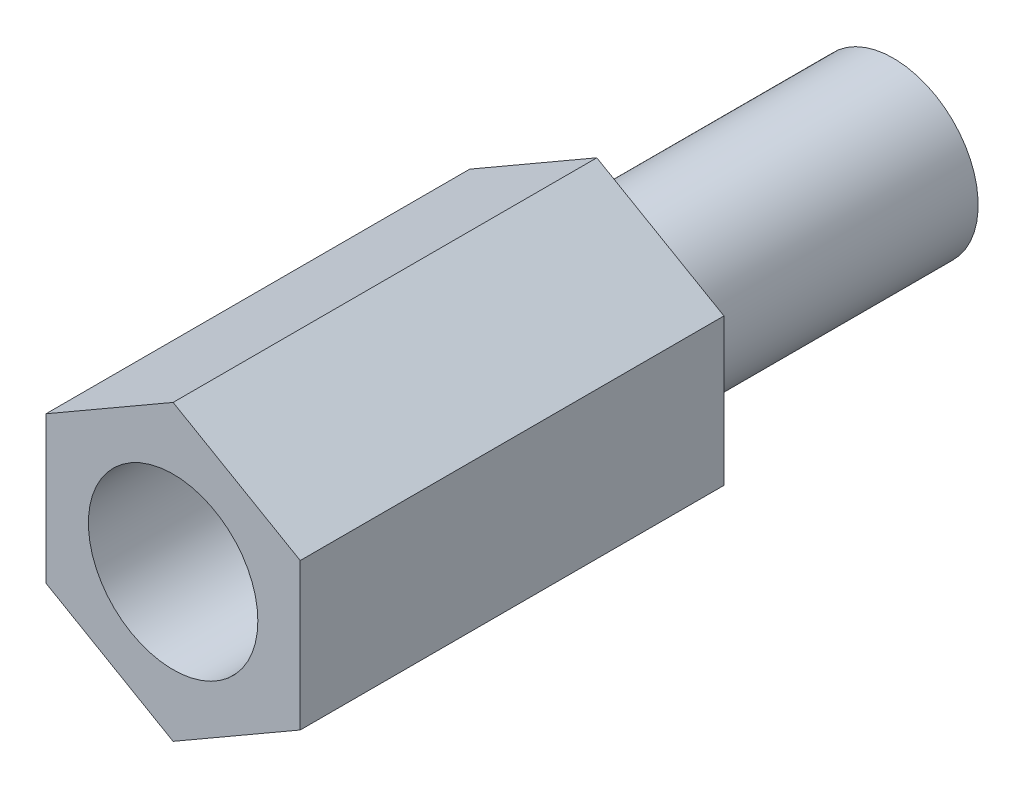
ISO-10303-21;
HEADER;
FILE_DESCRIPTION(('STEP AP214'),'2;1');
FILE_NAME('part.step','',(''),(''),'','','');
FILE_SCHEMA(('AUTOMOTIVE_DESIGN { 1 0 10303 214 1 1 1 1 }'));
ENDSEC;
DATA;
#1=APPLICATION_CONTEXT('core data for automotive mechanical design processes');
#2=APPLICATION_PROTOCOL_DEFINITION('international standard','automotive_design',2000,#1);
#3=PRODUCT_CONTEXT('',#1,'mechanical');
#4=PRODUCT('Part','Part','',(#3));
#5=PRODUCT_RELATED_PRODUCT_CATEGORY('part','',(#4));
#6=PRODUCT_DEFINITION_FORMATION('','',#4);
#7=PRODUCT_DEFINITION_CONTEXT('part definition',#1,'design');
#8=PRODUCT_DEFINITION('design','',#6,#7);
#9=PRODUCT_DEFINITION_SHAPE('','',#8);
#10=(LENGTH_UNIT() NAMED_UNIT(*) SI_UNIT(.MILLI.,.METRE.));
#11=(NAMED_UNIT(*) PLANE_ANGLE_UNIT() SI_UNIT($,.RADIAN.));
#12=(NAMED_UNIT(*) SI_UNIT($,.STERADIAN.) SOLID_ANGLE_UNIT());
#13=UNCERTAINTY_MEASURE_WITH_UNIT(LENGTH_MEASURE(1.E-05),#10,'distance_accuracy_value','');
#14=(GEOMETRIC_REPRESENTATION_CONTEXT(3) GLOBAL_UNCERTAINTY_ASSIGNED_CONTEXT((#13)) GLOBAL_UNIT_ASSIGNED_CONTEXT((#10,
#11,#12)) REPRESENTATION_CONTEXT('',''));
#15=CARTESIAN_POINT('',(0.,0.,0.));
#16=DIRECTION('',(0.,0.,1.));
#17=DIRECTION('',(1.,0.,0.));
#18=AXIS2_PLACEMENT_3D('',#15,#16,#17);
#19=CARTESIAN_POINT('',(-3.00000000000003,-1.73205080756889,10.));
#20=DIRECTION('',(0.5,0.866025403784439,0.));
#21=DIRECTION('',(-0.866025403784439,0.5,0.));
#22=AXIS2_PLACEMENT_3D('',#19,#20,#21);
#23=PLANE('',#22);
#24=DIRECTION('',(0.866025403784439,-0.5,0.));
#25=VECTOR('',#24,1.);
#26=CARTESIAN_POINT('',(-3.00000000000003,-1.73205080756889,0.));
#27=LINE('',#26,#25);
#28=CARTESIAN_POINT('',(-3.00000000000003,-1.73205080756889,0.));
#29=VERTEX_POINT('',#28);
#30=CARTESIAN_POINT('',(0.,-3.46410161513779,0.));
#31=VERTEX_POINT('',#30);
#32=EDGE_CURVE('E130',#29,#31,#27,.T.);
#33=ORIENTED_EDGE('',*,*,#32,.T.);
#34=DIRECTION('',(0.,0.,-1.));
#35=VECTOR('',#34,1.);
#36=CARTESIAN_POINT('',(0.,-3.46410161513779,10.));
#37=LINE('',#36,#35);
#38=CARTESIAN_POINT('',(0.,-3.46410161513779,10.));
#39=VERTEX_POINT('',#38);
#40=EDGE_CURVE('E42',#39,#31,#37,.T.);
#41=ORIENTED_EDGE('',*,*,#40,.F.);
#42=DIRECTION('',(0.866025403784439,-0.5,0.));
#43=VECTOR('',#42,1.);
#44=CARTESIAN_POINT('',(-3.00000000000003,-1.73205080756889,10.));
#45=LINE('',#44,#43);
#46=CARTESIAN_POINT('',(-3.00000000000003,-1.73205080756889,10.));
#47=VERTEX_POINT('',#46);
#48=EDGE_CURVE('E147',#47,#39,#45,.T.);
#49=ORIENTED_EDGE('',*,*,#48,.F.);
#50=DIRECTION('',(0.,0.,-1.));
#51=VECTOR('',#50,1.);
#52=CARTESIAN_POINT('',(-3.00000000000003,-1.73205080756889,10.));
#53=LINE('',#52,#51);
#54=EDGE_CURVE('E126',#47,#29,#53,.T.);
#55=ORIENTED_EDGE('',*,*,#54,.T.);
#56=EDGE_LOOP('',(#33,#41,#49,#55));
#57=FACE_BOUND('',#56,.T.);
#58=ADVANCED_FACE('F39',(#57),#23,.F.);
#59=CARTESIAN_POINT('',(0.,-3.46410161513779,10.));
#60=DIRECTION('',(-0.5,0.866025403784439,0.));
#61=DIRECTION('',(-0.866025403784439,-0.5,0.));
#62=AXIS2_PLACEMENT_3D('',#59,#60,#61);
#63=PLANE('',#62);
#64=DIRECTION('',(0.866025403784439,0.5,0.));
#65=VECTOR('',#64,1.);
#66=CARTESIAN_POINT('',(0.,-3.46410161513779,0.));
#67=LINE('',#66,#65);
#68=CARTESIAN_POINT('',(3.00000000000003,-1.73205080756889,0.));
#69=VERTEX_POINT('',#68);
#70=EDGE_CURVE('E134',#31,#69,#67,.T.);
#71=ORIENTED_EDGE('',*,*,#70,.T.);
#72=DIRECTION('',(0.,0.,-1.));
#73=VECTOR('',#72,1.);
#74=CARTESIAN_POINT('',(3.00000000000003,-1.73205080756889,10.));
#75=LINE('',#74,#73);
#76=CARTESIAN_POINT('',(3.00000000000003,-1.73205080756889,10.));
#77=VERTEX_POINT('',#76);
#78=EDGE_CURVE('E153',#77,#69,#75,.T.);
#79=ORIENTED_EDGE('',*,*,#78,.F.);
#80=DIRECTION('',(0.866025403784439,0.5,0.));
#81=VECTOR('',#80,1.);
#82=CARTESIAN_POINT('',(0.,-3.46410161513779,10.));
#83=LINE('',#82,#81);
#84=EDGE_CURVE('E95',#39,#77,#83,.T.);
#85=ORIENTED_EDGE('',*,*,#84,.F.);
#86=ORIENTED_EDGE('',*,*,#40,.T.);
#87=EDGE_LOOP('',(#71,#79,#85,#86));
#88=FACE_BOUND('',#87,.T.);
#89=ADVANCED_FACE('F160',(#88),#63,.F.);
#90=CARTESIAN_POINT('',(3.00000000000003,-1.73205080756889,10.));
#91=DIRECTION('',(-1.,0.,0.));
#92=DIRECTION('',(0.,0.,1.));
#93=AXIS2_PLACEMENT_3D('',#90,#91,#92);
#94=PLANE('',#93);
#95=DIRECTION('',(0.,1.,0.));
#96=VECTOR('',#95,1.);
#97=CARTESIAN_POINT('',(3.00000000000003,-1.73205080756889,0.));
#98=LINE('',#97,#96);
#99=CARTESIAN_POINT('',(3.00000000000003,1.7320508075689,0.));
#100=VERTEX_POINT('',#99);
#101=EDGE_CURVE('E138',#69,#100,#98,.T.);
#102=ORIENTED_EDGE('',*,*,#101,.T.);
#103=DIRECTION('',(0.,0.,-1.));
#104=VECTOR('',#103,1.);
#105=CARTESIAN_POINT('',(3.00000000000003,1.7320508075689,10.));
#106=LINE('',#105,#104);
#107=CARTESIAN_POINT('',(3.00000000000003,1.7320508075689,10.));
#108=VERTEX_POINT('',#107);
#109=EDGE_CURVE('E119',#108,#100,#106,.T.);
#110=ORIENTED_EDGE('',*,*,#109,.F.);
#111=DIRECTION('',(0.,1.,0.));
#112=VECTOR('',#111,1.);
#113=CARTESIAN_POINT('',(3.00000000000003,-1.73205080756889,10.));
#114=LINE('',#113,#112);
#115=EDGE_CURVE('E108',#77,#108,#114,.T.);
#116=ORIENTED_EDGE('',*,*,#115,.F.);
#117=ORIENTED_EDGE('',*,*,#78,.T.);
#118=EDGE_LOOP('',(#102,#110,#116,#117));
#119=FACE_BOUND('',#118,.T.);
#120=ADVANCED_FACE('F166',(#119),#94,.F.);
#121=CARTESIAN_POINT('',(3.00000000000003,1.7320508075689,10.));
#122=DIRECTION('',(-0.5,-0.866025403784438,0.));
#123=DIRECTION('',(0.866025403784439,-0.5,0.));
#124=AXIS2_PLACEMENT_3D('',#121,#122,#123);
#125=PLANE('',#124);
#126=DIRECTION('',(-0.866025403784439,0.5,0.));
#127=VECTOR('',#126,1.);
#128=CARTESIAN_POINT('',(3.00000000000003,1.7320508075689,0.));
#129=LINE('',#128,#127);
#130=CARTESIAN_POINT('',(0.,3.46410161513779,0.));
#131=VERTEX_POINT('',#130);
#132=EDGE_CURVE('E117',#100,#131,#129,.T.);
#133=ORIENTED_EDGE('',*,*,#132,.T.);
#134=DIRECTION('',(0.,0.,-1.));
#135=VECTOR('',#134,1.);
#136=CARTESIAN_POINT('',(0.,3.46410161513779,10.));
#137=LINE('',#136,#135);
#138=CARTESIAN_POINT('',(0.,3.46410161513779,10.));
#139=VERTEX_POINT('',#138);
#140=EDGE_CURVE('E114',#139,#131,#137,.T.);
#141=ORIENTED_EDGE('',*,*,#140,.F.);
#142=DIRECTION('',(-0.866025403784439,0.5,0.));
#143=VECTOR('',#142,1.);
#144=CARTESIAN_POINT('',(3.00000000000003,1.7320508075689,10.));
#145=LINE('',#144,#143);
#146=EDGE_CURVE('E102',#108,#139,#145,.T.);
#147=ORIENTED_EDGE('',*,*,#146,.F.);
#148=ORIENTED_EDGE('',*,*,#109,.T.);
#149=EDGE_LOOP('',(#133,#141,#147,#148));
#150=FACE_BOUND('',#149,.T.);
#151=ADVANCED_FACE('F115',(#150),#125,.F.);
#152=CARTESIAN_POINT('',(0.,3.46410161513779,10.));
#153=DIRECTION('',(0.500000000000001,-0.866025403784438,0.));
#154=DIRECTION('',(0.866025403784438,0.500000000000001,0.));
#155=AXIS2_PLACEMENT_3D('',#152,#153,#154);
#156=PLANE('',#155);
#157=DIRECTION('',(-0.866025403784438,-0.500000000000001,0.));
#158=VECTOR('',#157,1.);
#159=CARTESIAN_POINT('',(0.,3.46410161513779,0.));
#160=LINE('',#159,#158);
#161=CARTESIAN_POINT('',(-3.00000000000003,1.73205080756889,0.));
#162=VERTEX_POINT('',#161);
#163=EDGE_CURVE('E80',#131,#162,#160,.T.);
#164=ORIENTED_EDGE('',*,*,#163,.T.);
#165=DIRECTION('',(0.,0.,-1.));
#166=VECTOR('',#165,1.);
#167=CARTESIAN_POINT('',(-3.00000000000003,1.73205080756889,10.));
#168=LINE('',#167,#166);
#169=CARTESIAN_POINT('',(-3.00000000000003,1.73205080756889,10.));
#170=VERTEX_POINT('',#169);
#171=EDGE_CURVE('E120',#170,#162,#168,.T.);
#172=ORIENTED_EDGE('',*,*,#171,.F.);
#173=DIRECTION('',(-0.866025403784438,-0.500000000000001,0.));
#174=VECTOR('',#173,1.);
#175=CARTESIAN_POINT('',(0.,3.46410161513779,10.));
#176=LINE('',#175,#174);
#177=EDGE_CURVE('E106',#139,#170,#176,.T.);
#178=ORIENTED_EDGE('',*,*,#177,.F.);
#179=ORIENTED_EDGE('',*,*,#140,.T.);
#180=EDGE_LOOP('',(#164,#172,#178,#179));
#181=FACE_BOUND('',#180,.T.);
#182=ADVANCED_FACE('F122',(#181),#156,.F.);
#183=CARTESIAN_POINT('',(-3.00000000000003,1.73205080756889,10.));
#184=DIRECTION('',(1.,0.,0.));
#185=DIRECTION('',(0.,1.,0.));
#186=AXIS2_PLACEMENT_3D('',#183,#184,#185);
#187=PLANE('',#186);
#188=DIRECTION('',(0.,-1.,0.));
#189=VECTOR('',#188,1.);
#190=CARTESIAN_POINT('',(-3.00000000000003,1.73205080756889,0.));
#191=LINE('',#190,#189);
#192=EDGE_CURVE('E86',#162,#29,#191,.T.);
#193=ORIENTED_EDGE('',*,*,#192,.T.);
#194=ORIENTED_EDGE('',*,*,#54,.F.);
#195=DIRECTION('',(0.,-1.,0.));
#196=VECTOR('',#195,1.);
#197=CARTESIAN_POINT('',(-3.00000000000003,1.73205080756889,10.));
#198=LINE('',#197,#196);
#199=EDGE_CURVE('E57',#170,#47,#198,.T.);
#200=ORIENTED_EDGE('',*,*,#199,.F.);
#201=ORIENTED_EDGE('',*,*,#171,.T.);
#202=EDGE_LOOP('',(#193,#194,#200,#201));
#203=FACE_BOUND('',#202,.T.);
#204=ADVANCED_FACE('F203',(#203),#187,.F.);
#205=CARTESIAN_POINT('',(0.,0.,10.));
#206=DIRECTION('',(0.,0.,1.));
#207=DIRECTION('',(1.,0.,0.));
#208=AXIS2_PLACEMENT_3D('',#205,#206,#207);
#209=PLANE('',#208);
#210=CARTESIAN_POINT('',(0.,0.,10.));
#211=DIRECTION('',(0.,0.,1.));
#212=DIRECTION('',(1.,0.,0.));
#213=AXIS2_PLACEMENT_3D('',#210,#211,#212);
#214=CIRCLE('',#213,2.);
#215=CARTESIAN_POINT('',(2.,0.,10.));
#216=VERTEX_POINT('',#215);
#217=EDGE_CURVE('E173',#216,#216,#214,.T.);
#218=ORIENTED_EDGE('',*,*,#217,.F.);
#219=EDGE_LOOP('',(#218));
#220=FACE_BOUND('',#219,.T.);
#221=ORIENTED_EDGE('',*,*,#48,.T.);
#222=ORIENTED_EDGE('',*,*,#84,.T.);
#223=ORIENTED_EDGE('',*,*,#115,.T.);
#224=ORIENTED_EDGE('',*,*,#146,.T.);
#225=ORIENTED_EDGE('',*,*,#177,.T.);
#226=ORIENTED_EDGE('',*,*,#199,.T.);
#227=EDGE_LOOP('',(#221,#222,#223,#224,#225,#226));
#228=FACE_BOUND('',#227,.T.);
#229=ADVANCED_FACE('F104',(#220,#228),#209,.T.);
#230=CARTESIAN_POINT('',(0.,0.,0.));
#231=DIRECTION('',(0.,0.,1.));
#232=DIRECTION('',(1.,0.,0.));
#233=AXIS2_PLACEMENT_3D('',#230,#231,#232);
#234=PLANE('',#233);
#235=CARTESIAN_POINT('',(0.,0.,0.));
#236=DIRECTION('',(0.,0.,-1.));
#237=DIRECTION('',(-1.,0.,0.));
#238=AXIS2_PLACEMENT_3D('',#235,#236,#237);
#239=CIRCLE('',#238,2.);
#240=CARTESIAN_POINT('',(-2.,0.,0.));
#241=VERTEX_POINT('',#240);
#242=EDGE_CURVE('E11',#241,#241,#239,.T.);
#243=ORIENTED_EDGE('',*,*,#242,.F.);
#244=EDGE_LOOP('',(#243));
#245=FACE_BOUND('',#244,.T.);
#246=ORIENTED_EDGE('',*,*,#32,.F.);
#247=ORIENTED_EDGE('',*,*,#192,.F.);
#248=ORIENTED_EDGE('',*,*,#163,.F.);
#249=ORIENTED_EDGE('',*,*,#132,.F.);
#250=ORIENTED_EDGE('',*,*,#101,.F.);
#251=ORIENTED_EDGE('',*,*,#70,.F.);
#252=EDGE_LOOP('',(#246,#247,#248,#249,#250,#251));
#253=FACE_BOUND('',#252,.T.);
#254=ADVANCED_FACE('F165',(#245,#253),#234,.F.);
#255=CARTESIAN_POINT('',(0.,0.,6.));
#256=DIRECTION('',(0.,0.,1.));
#257=DIRECTION('',(1.,0.,0.));
#258=AXIS2_PLACEMENT_3D('',#255,#256,#257);
#259=CYLINDRICAL_SURFACE('',#258,2.);
#260=CARTESIAN_POINT('',(0.,0.,6.));
#261=DIRECTION('',(0.,0.,1.));
#262=DIRECTION('',(1.,0.,0.));
#263=AXIS2_PLACEMENT_3D('',#260,#261,#262);
#264=CIRCLE('',#263,2.);
#265=CARTESIAN_POINT('',(2.,0.,6.));
#266=VERTEX_POINT('',#265);
#267=EDGE_CURVE('E135',#266,#266,#264,.T.);
#268=ORIENTED_EDGE('',*,*,#267,.F.);
#269=EDGE_LOOP('',(#268));
#270=FACE_BOUND('',#269,.T.);
#271=ORIENTED_EDGE('',*,*,#217,.T.);
#272=EDGE_LOOP('',(#271));
#273=FACE_BOUND('',#272,.T.);
#274=ADVANCED_FACE('F195',(#270,#273),#259,.F.);
#275=CARTESIAN_POINT('',(0.,0.,6.));
#276=DIRECTION('',(0.,0.,1.));
#277=DIRECTION('',(1.,0.,0.));
#278=AXIS2_PLACEMENT_3D('',#275,#276,#277);
#279=PLANE('',#278);
#280=ORIENTED_EDGE('',*,*,#267,.T.);
#281=EDGE_LOOP('',(#280));
#282=FACE_BOUND('',#281,.T.);
#283=ADVANCED_FACE('F190',(#282),#279,.T.);
#284=CARTESIAN_POINT('',(0.,0.,-7.));
#285=DIRECTION('',(0.,0.,1.));
#286=DIRECTION('',(1.,0.,0.));
#287=AXIS2_PLACEMENT_3D('',#284,#285,#286);
#288=CYLINDRICAL_SURFACE('',#287,2.);
#289=CARTESIAN_POINT('',(0.,0.,-7.));
#290=DIRECTION('',(0.,0.,-1.));
#291=DIRECTION('',(-1.,0.,0.));
#292=AXIS2_PLACEMENT_3D('',#289,#290,#291);
#293=CIRCLE('',#292,2.);
#294=CARTESIAN_POINT('',(-2.,0.,-7.));
#295=VERTEX_POINT('',#294);
#296=EDGE_CURVE('E177',#295,#295,#293,.T.);
#297=ORIENTED_EDGE('',*,*,#296,.F.);
#298=EDGE_LOOP('',(#297));
#299=FACE_BOUND('',#298,.T.);
#300=ORIENTED_EDGE('',*,*,#242,.T.);
#301=EDGE_LOOP('',(#300));
#302=FACE_BOUND('',#301,.T.);
#303=ADVANCED_FACE('F187',(#299,#302),#288,.T.);
#304=CARTESIAN_POINT('',(0.,0.,-7.));
#305=DIRECTION('',(0.,0.,-1.));
#306=DIRECTION('',(-1.,0.,0.));
#307=AXIS2_PLACEMENT_3D('',#304,#305,#306);
#308=PLANE('',#307);
#309=ORIENTED_EDGE('',*,*,#296,.T.);
#310=EDGE_LOOP('',(#309));
#311=FACE_BOUND('',#310,.T.);
#312=ADVANCED_FACE('F185',(#311),#308,.T.);
#313=CLOSED_SHELL('',(#58,#89,#120,#151,#182,#204,#229,#254,#274,#283,#303,#312));
#314=MANIFOLD_SOLID_BREP('B2',#313);
#315=ADVANCED_BREP_SHAPE_REPRESENTATION('',(#18,#314),#14);
#316=SHAPE_DEFINITION_REPRESENTATION(#9,#315);
ENDSEC;
END-ISO-10303-21;
